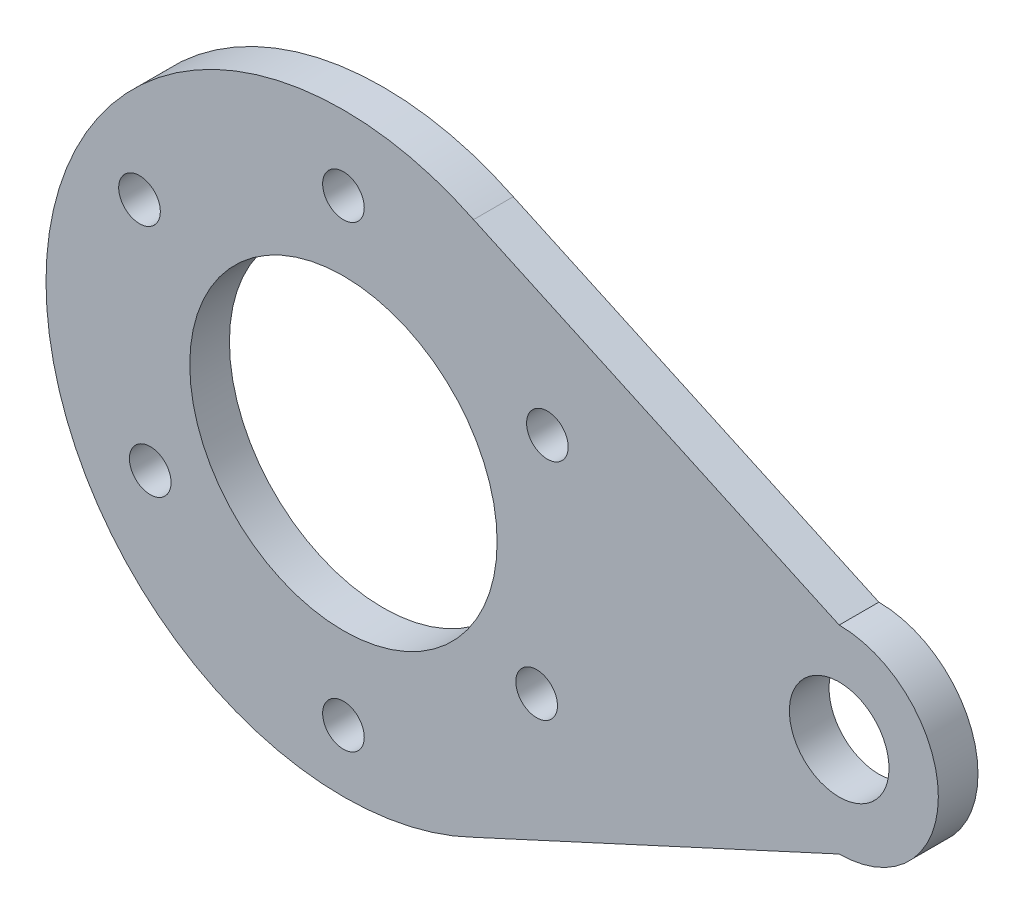
ISO-10303-21;
HEADER;
FILE_DESCRIPTION(('STEP AP214'),'2;1');
FILE_NAME('part.step','',(''),(''),'','','');
FILE_SCHEMA(('AUTOMOTIVE_DESIGN { 1 0 10303 214 1 1 1 1 }'));
ENDSEC;
DATA;
#1=APPLICATION_CONTEXT('core data for automotive mechanical design processes');
#2=APPLICATION_PROTOCOL_DEFINITION('international standard','automotive_design',2000,#1);
#3=PRODUCT_CONTEXT('',#1,'mechanical');
#4=PRODUCT('Part','Part','',(#3));
#5=PRODUCT_RELATED_PRODUCT_CATEGORY('part','',(#4));
#6=PRODUCT_DEFINITION_FORMATION('','',#4);
#7=PRODUCT_DEFINITION_CONTEXT('part definition',#1,'design');
#8=PRODUCT_DEFINITION('design','',#6,#7);
#9=PRODUCT_DEFINITION_SHAPE('','',#8);
#10=(LENGTH_UNIT() NAMED_UNIT(*) SI_UNIT(.MILLI.,.METRE.));
#11=(NAMED_UNIT(*) PLANE_ANGLE_UNIT() SI_UNIT($,.RADIAN.));
#12=(NAMED_UNIT(*) SI_UNIT($,.STERADIAN.) SOLID_ANGLE_UNIT());
#13=UNCERTAINTY_MEASURE_WITH_UNIT(LENGTH_MEASURE(1.E-05),#10,'distance_accuracy_value','');
#14=(GEOMETRIC_REPRESENTATION_CONTEXT(3) GLOBAL_UNCERTAINTY_ASSIGNED_CONTEXT((#13)) GLOBAL_UNIT_ASSIGNED_CONTEXT((#10,
#11,#12)) REPRESENTATION_CONTEXT('',''));
#15=CARTESIAN_POINT('',(0.,0.,0.));
#16=DIRECTION('',(0.,0.,1.));
#17=DIRECTION('',(1.,0.,0.));
#18=AXIS2_PLACEMENT_3D('',#15,#16,#17);
#19=CARTESIAN_POINT('',(52.5740743672686,-5.52758783429424,4.));
#20=DIRECTION('',(0.,0.,-1.));
#21=DIRECTION('',(-1.,0.,0.));
#22=AXIS2_PLACEMENT_3D('',#19,#20,#21);
#23=PLANE('',#22);
#24=CARTESIAN_POINT('',(52.5740743672686,-5.52758783429424,4.));
#25=DIRECTION('',(0.,0.,1.));
#26=DIRECTION('',(-1.,0.,0.));
#27=AXIS2_PLACEMENT_3D('',#24,#25,#26);
#28=CIRCLE('',#27,9.99999999999999);
#29=CARTESIAN_POINT('',(52.5740743672686,-15.5275878342942,4.));
#30=VERTEX_POINT('',#29);
#31=CARTESIAN_POINT('',(52.5740743672686,4.47241216570575,4.));
#32=VERTEX_POINT('',#31);
#33=EDGE_CURVE('E89',#30,#32,#28,.T.);
#34=ORIENTED_EDGE('',*,*,#33,.T.);
#35=DIRECTION('',(-0.90835898455297,0.418191290179384,0.));
#36=VECTOR('',#35,1.);
#37=CARTESIAN_POINT('',(52.5740743672686,4.47241216570575,4.));
#38=LINE('',#37,#36);
#39=CARTESIAN_POINT('',(15.6990743672686,21.4489644843398,4.));
#40=VERTEX_POINT('',#39);
#41=EDGE_CURVE('E84',#32,#40,#38,.T.);
#42=ORIENTED_EDGE('',*,*,#41,.T.);
#43=CARTESIAN_POINT('',(2.57407436726858,-5.52758783429424,4.));
#44=DIRECTION('',(0.,0.,1.));
#45=DIRECTION('',(1.,0.,0.));
#46=AXIS2_PLACEMENT_3D('',#43,#44,#45);
#47=CIRCLE('',#46,30.);
#48=CARTESIAN_POINT('',(15.6990743672686,-32.5041401529283,4.));
#49=VERTEX_POINT('',#48);
#50=EDGE_CURVE('E87',#40,#49,#47,.T.);
#51=ORIENTED_EDGE('',*,*,#50,.T.);
#52=DIRECTION('',(0.90835898455297,0.418191290179384,0.));
#53=VECTOR('',#52,1.);
#54=CARTESIAN_POINT('',(15.6990743672686,-32.5041401529283,4.));
#55=LINE('',#54,#53);
#56=EDGE_CURVE('E54',#49,#30,#55,.T.);
#57=ORIENTED_EDGE('',*,*,#56,.T.);
#58=EDGE_LOOP('',(#34,#42,#51,#57));
#59=FACE_BOUND('',#58,.T.);
#60=CARTESIAN_POINT('',(2.57407436726858,-29.2775878342943,4.));
#61=DIRECTION('',(0.,0.,1.));
#62=DIRECTION('',(1.,0.,0.));
#63=AXIS2_PLACEMENT_3D('',#60,#61,#62);
#64=CIRCLE('',#63,2.1);
#65=CARTESIAN_POINT('',(4.67407436726858,-29.2775878342943,4.));
#66=VERTEX_POINT('',#65);
#67=EDGE_CURVE('E104',#66,#66,#64,.T.);
#68=ORIENTED_EDGE('',*,*,#67,.F.);
#69=EDGE_LOOP('',(#68));
#70=FACE_BOUND('',#69,.T.);
#71=CARTESIAN_POINT('',(22.0596459524184,-16.7775878342942,4.));
#72=DIRECTION('',(0.,0.,1.));
#73=DIRECTION('',(1.,0.,0.));
#74=AXIS2_PLACEMENT_3D('',#71,#72,#73);
#75=CIRCLE('',#74,2.1);
#76=CARTESIAN_POINT('',(24.1596459524184,-16.7775878342942,4.));
#77=VERTEX_POINT('',#76);
#78=EDGE_CURVE('E119',#77,#77,#75,.T.);
#79=ORIENTED_EDGE('',*,*,#78,.F.);
#80=EDGE_LOOP('',(#79));
#81=FACE_BOUND('',#80,.T.);
#82=CARTESIAN_POINT('',(-17.9940289726118,6.34741216570586,4.));
#83=DIRECTION('',(0.,0.,1.));
#84=DIRECTION('',(1.,0.,0.));
#85=AXIS2_PLACEMENT_3D('',#82,#83,#84);
#86=CIRCLE('',#85,2.1);
#87=CARTESIAN_POINT('',(-15.8940289726118,6.34741216570586,4.));
#88=VERTEX_POINT('',#87);
#89=EDGE_CURVE('E125',#88,#88,#86,.T.);
#90=ORIENTED_EDGE('',*,*,#89,.F.);
#91=EDGE_LOOP('',(#90));
#92=FACE_BOUND('',#91,.T.);
#93=CARTESIAN_POINT('',(23.1421777071491,6.34741216570556,4.));
#94=DIRECTION('',(0.,0.,1.));
#95=DIRECTION('',(1.,0.,0.));
#96=AXIS2_PLACEMENT_3D('',#93,#94,#95);
#97=CIRCLE('',#96,2.1);
#98=CARTESIAN_POINT('',(25.2421777071491,6.34741216570556,4.));
#99=VERTEX_POINT('',#98);
#100=EDGE_CURVE('E131',#99,#99,#97,.T.);
#101=ORIENTED_EDGE('',*,*,#100,.F.);
#102=EDGE_LOOP('',(#101));
#103=FACE_BOUND('',#102,.T.);
#104=CARTESIAN_POINT('',(2.57407436726858,-5.52758783429424,4.));
#105=DIRECTION('',(0.,0.,1.));
#106=DIRECTION('',(1.,0.,0.));
#107=AXIS2_PLACEMENT_3D('',#104,#105,#106);
#108=CIRCLE('',#107,15.5);
#109=CARTESIAN_POINT('',(18.0740743672686,-5.52758783429424,4.));
#110=VERTEX_POINT('',#109);
#111=EDGE_CURVE('E137',#110,#110,#108,.T.);
#112=ORIENTED_EDGE('',*,*,#111,.F.);
#113=EDGE_LOOP('',(#112));
#114=FACE_BOUND('',#113,.T.);
#115=CARTESIAN_POINT('',(52.5740743672686,-5.52758783429424,4.));
#116=DIRECTION('',(0.,0.,1.));
#117=DIRECTION('',(1.,0.,0.));
#118=AXIS2_PLACEMENT_3D('',#115,#116,#117);
#119=CIRCLE('',#118,5.025);
#120=CARTESIAN_POINT('',(57.5990743672686,-5.52758783429424,4.));
#121=VERTEX_POINT('',#120);
#122=EDGE_CURVE('E143',#121,#121,#119,.T.);
#123=ORIENTED_EDGE('',*,*,#122,.F.);
#124=EDGE_LOOP('',(#123));
#125=FACE_BOUND('',#124,.T.);
#126=CARTESIAN_POINT('',(2.57407436726846,16.9724121657058,4.));
#127=DIRECTION('',(0.,0.,1.));
#128=DIRECTION('',(1.,0.,0.));
#129=AXIS2_PLACEMENT_3D('',#126,#127,#128);
#130=CIRCLE('',#129,2.1);
#131=CARTESIAN_POINT('',(4.67407436726846,16.9724121657058,4.));
#132=VERTEX_POINT('',#131);
#133=EDGE_CURVE('E149',#132,#132,#130,.T.);
#134=ORIENTED_EDGE('',*,*,#133,.F.);
#135=EDGE_LOOP('',(#134));
#136=FACE_BOUND('',#135,.T.);
#137=CARTESIAN_POINT('',(-16.9114972178812,-16.7775878342944,4.));
#138=DIRECTION('',(0.,0.,1.));
#139=DIRECTION('',(1.,0.,0.));
#140=AXIS2_PLACEMENT_3D('',#137,#138,#139);
#141=CIRCLE('',#140,2.1);
#142=CARTESIAN_POINT('',(-14.8114972178812,-16.7775878342944,4.));
#143=VERTEX_POINT('',#142);
#144=EDGE_CURVE('E155',#143,#143,#141,.T.);
#145=ORIENTED_EDGE('',*,*,#144,.F.);
#146=EDGE_LOOP('',(#145));
#147=FACE_BOUND('',#146,.T.);
#148=ADVANCED_FACE('F37',(#59,#70,#81,#92,#103,#114,#125,#136,#147),#23,.F.);
#149=CARTESIAN_POINT('',(52.5740743672686,-5.52758783429424,0.));
#150=DIRECTION('',(0.,0.,-1.));
#151=DIRECTION('',(-1.,0.,0.));
#152=AXIS2_PLACEMENT_3D('',#149,#150,#151);
#153=PLANE('',#152);
#154=CARTESIAN_POINT('',(2.57407436726846,16.9724121657058,0.));
#155=DIRECTION('',(0.,0.,1.));
#156=DIRECTION('',(1.,0.,0.));
#157=AXIS2_PLACEMENT_3D('',#154,#155,#156);
#158=CIRCLE('',#157,2.1);
#159=CARTESIAN_POINT('',(4.67407436726846,16.9724121657058,0.));
#160=VERTEX_POINT('',#159);
#161=EDGE_CURVE('E152',#160,#160,#158,.T.);
#162=ORIENTED_EDGE('',*,*,#161,.T.);
#163=EDGE_LOOP('',(#162));
#164=FACE_BOUND('',#163,.T.);
#165=CARTESIAN_POINT('',(2.57407436726858,-5.52758783429424,0.));
#166=DIRECTION('',(0.,0.,1.));
#167=DIRECTION('',(1.,0.,0.));
#168=AXIS2_PLACEMENT_3D('',#165,#166,#167);
#169=CIRCLE('',#168,15.5);
#170=CARTESIAN_POINT('',(18.0740743672686,-5.52758783429424,0.));
#171=VERTEX_POINT('',#170);
#172=EDGE_CURVE('E140',#171,#171,#169,.T.);
#173=ORIENTED_EDGE('',*,*,#172,.T.);
#174=EDGE_LOOP('',(#173));
#175=FACE_BOUND('',#174,.T.);
#176=CARTESIAN_POINT('',(-17.9940289726118,6.34741216570586,0.));
#177=DIRECTION('',(0.,0.,1.));
#178=DIRECTION('',(1.,0.,0.));
#179=AXIS2_PLACEMENT_3D('',#176,#177,#178);
#180=CIRCLE('',#179,2.1);
#181=CARTESIAN_POINT('',(-15.8940289726118,6.34741216570586,0.));
#182=VERTEX_POINT('',#181);
#183=EDGE_CURVE('E128',#182,#182,#180,.T.);
#184=ORIENTED_EDGE('',*,*,#183,.T.);
#185=EDGE_LOOP('',(#184));
#186=FACE_BOUND('',#185,.T.);
#187=CARTESIAN_POINT('',(2.57407436726858,-29.2775878342943,0.));
#188=DIRECTION('',(0.,0.,1.));
#189=DIRECTION('',(1.,0.,0.));
#190=AXIS2_PLACEMENT_3D('',#187,#188,#189);
#191=CIRCLE('',#190,2.1);
#192=CARTESIAN_POINT('',(4.67407436726858,-29.2775878342943,0.));
#193=VERTEX_POINT('',#192);
#194=EDGE_CURVE('E116',#193,#193,#191,.T.);
#195=ORIENTED_EDGE('',*,*,#194,.T.);
#196=EDGE_LOOP('',(#195));
#197=FACE_BOUND('',#196,.T.);
#198=CARTESIAN_POINT('',(52.5740743672686,-5.52758783429424,0.));
#199=DIRECTION('',(0.,0.,1.));
#200=DIRECTION('',(-1.,0.,0.));
#201=AXIS2_PLACEMENT_3D('',#198,#199,#200);
#202=CIRCLE('',#201,9.99999999999999);
#203=CARTESIAN_POINT('',(52.5740743672686,-15.5275878342942,0.));
#204=VERTEX_POINT('',#203);
#205=CARTESIAN_POINT('',(52.5740743672686,4.47241216570575,0.));
#206=VERTEX_POINT('',#205);
#207=EDGE_CURVE('E101',#204,#206,#202,.T.);
#208=ORIENTED_EDGE('',*,*,#207,.F.);
#209=DIRECTION('',(0.90835898455297,0.418191290179384,0.));
#210=VECTOR('',#209,1.);
#211=CARTESIAN_POINT('',(15.6990743672686,-32.5041401529283,0.));
#212=LINE('',#211,#210);
#213=CARTESIAN_POINT('',(15.6990743672686,-32.5041401529283,0.));
#214=VERTEX_POINT('',#213);
#215=EDGE_CURVE('E77',#214,#204,#212,.T.);
#216=ORIENTED_EDGE('',*,*,#215,.F.);
#217=CARTESIAN_POINT('',(2.57407436726858,-5.52758783429424,0.));
#218=DIRECTION('',(0.,0.,1.));
#219=DIRECTION('',(1.,0.,0.));
#220=AXIS2_PLACEMENT_3D('',#217,#218,#219);
#221=CIRCLE('',#220,30.);
#222=CARTESIAN_POINT('',(15.6990743672686,21.4489644843398,0.));
#223=VERTEX_POINT('',#222);
#224=EDGE_CURVE('E71',#223,#214,#221,.T.);
#225=ORIENTED_EDGE('',*,*,#224,.F.);
#226=DIRECTION('',(-0.90835898455297,0.418191290179384,0.));
#227=VECTOR('',#226,1.);
#228=CARTESIAN_POINT('',(52.5740743672686,4.47241216570575,0.));
#229=LINE('',#228,#227);
#230=EDGE_CURVE('E93',#206,#223,#229,.T.);
#231=ORIENTED_EDGE('',*,*,#230,.F.);
#232=EDGE_LOOP('',(#208,#216,#225,#231));
#233=FACE_BOUND('',#232,.T.);
#234=CARTESIAN_POINT('',(22.0596459524184,-16.7775878342942,0.));
#235=DIRECTION('',(0.,0.,1.));
#236=DIRECTION('',(1.,0.,0.));
#237=AXIS2_PLACEMENT_3D('',#234,#235,#236);
#238=CIRCLE('',#237,2.1);
#239=CARTESIAN_POINT('',(24.1596459524184,-16.7775878342942,0.));
#240=VERTEX_POINT('',#239);
#241=EDGE_CURVE('E122',#240,#240,#238,.T.);
#242=ORIENTED_EDGE('',*,*,#241,.T.);
#243=EDGE_LOOP('',(#242));
#244=FACE_BOUND('',#243,.T.);
#245=CARTESIAN_POINT('',(23.1421777071491,6.34741216570556,0.));
#246=DIRECTION('',(0.,0.,1.));
#247=DIRECTION('',(1.,0.,0.));
#248=AXIS2_PLACEMENT_3D('',#245,#246,#247);
#249=CIRCLE('',#248,2.1);
#250=CARTESIAN_POINT('',(25.2421777071491,6.34741216570556,0.));
#251=VERTEX_POINT('',#250);
#252=EDGE_CURVE('E134',#251,#251,#249,.T.);
#253=ORIENTED_EDGE('',*,*,#252,.T.);
#254=EDGE_LOOP('',(#253));
#255=FACE_BOUND('',#254,.T.);
#256=CARTESIAN_POINT('',(52.5740743672686,-5.52758783429424,0.));
#257=DIRECTION('',(0.,0.,1.));
#258=DIRECTION('',(1.,0.,0.));
#259=AXIS2_PLACEMENT_3D('',#256,#257,#258);
#260=CIRCLE('',#259,5.025);
#261=CARTESIAN_POINT('',(57.5990743672686,-5.52758783429424,0.));
#262=VERTEX_POINT('',#261);
#263=EDGE_CURVE('E146',#262,#262,#260,.T.);
#264=ORIENTED_EDGE('',*,*,#263,.T.);
#265=EDGE_LOOP('',(#264));
#266=FACE_BOUND('',#265,.T.);
#267=CARTESIAN_POINT('',(-16.9114972178812,-16.7775878342944,0.));
#268=DIRECTION('',(0.,0.,1.));
#269=DIRECTION('',(1.,0.,0.));
#270=AXIS2_PLACEMENT_3D('',#267,#268,#269);
#271=CIRCLE('',#270,2.1);
#272=CARTESIAN_POINT('',(-14.8114972178812,-16.7775878342944,0.));
#273=VERTEX_POINT('',#272);
#274=EDGE_CURVE('E158',#273,#273,#271,.T.);
#275=ORIENTED_EDGE('',*,*,#274,.T.);
#276=EDGE_LOOP('',(#275));
#277=FACE_BOUND('',#276,.T.);
#278=ADVANCED_FACE('F112',(#164,#175,#186,#197,#233,#244,#255,#266,#277),#153,.T.);
#279=CARTESIAN_POINT('',(52.5740743672686,-5.52758783429424,4.));
#280=DIRECTION('',(0.,0.,-1.));
#281=DIRECTION('',(-1.,0.,0.));
#282=AXIS2_PLACEMENT_3D('',#279,#280,#281);
#283=CYLINDRICAL_SURFACE('',#282,9.99999999999999);
#284=ORIENTED_EDGE('',*,*,#207,.T.);
#285=DIRECTION('',(0.,0.,-1.));
#286=VECTOR('',#285,1.);
#287=CARTESIAN_POINT('',(52.5740743672686,4.47241216570575,4.));
#288=LINE('',#287,#286);
#289=EDGE_CURVE('E11',#32,#206,#288,.T.);
#290=ORIENTED_EDGE('',*,*,#289,.F.);
#291=ORIENTED_EDGE('',*,*,#33,.F.);
#292=DIRECTION('',(0.,0.,-1.));
#293=VECTOR('',#292,1.);
#294=CARTESIAN_POINT('',(52.5740743672686,-15.5275878342942,4.));
#295=LINE('',#294,#293);
#296=EDGE_CURVE('E97',#30,#204,#295,.T.);
#297=ORIENTED_EDGE('',*,*,#296,.T.);
#298=EDGE_LOOP('',(#284,#290,#291,#297));
#299=FACE_BOUND('',#298,.T.);
#300=ADVANCED_FACE('F39',(#299),#283,.T.);
#301=CARTESIAN_POINT('',(52.5740743672686,4.47241216570575,4.));
#302=DIRECTION('',(-0.418191290179384,-0.90835898455297,0.));
#303=DIRECTION('',(0.90835898455297,-0.418191290179384,0.));
#304=AXIS2_PLACEMENT_3D('',#301,#302,#303);
#305=PLANE('',#304);
#306=ORIENTED_EDGE('',*,*,#230,.T.);
#307=DIRECTION('',(0.,0.,-1.));
#308=VECTOR('',#307,1.);
#309=CARTESIAN_POINT('',(15.6990743672686,21.4489644843398,4.));
#310=LINE('',#309,#308);
#311=EDGE_CURVE('E46',#40,#223,#310,.T.);
#312=ORIENTED_EDGE('',*,*,#311,.F.);
#313=ORIENTED_EDGE('',*,*,#41,.F.);
#314=ORIENTED_EDGE('',*,*,#289,.T.);
#315=EDGE_LOOP('',(#306,#312,#313,#314));
#316=FACE_BOUND('',#315,.T.);
#317=ADVANCED_FACE('F92',(#316),#305,.F.);
#318=CARTESIAN_POINT('',(2.57407436726858,-5.52758783429424,4.));
#319=DIRECTION('',(0.,0.,-1.));
#320=DIRECTION('',(-1.,0.,0.));
#321=AXIS2_PLACEMENT_3D('',#318,#319,#320);
#322=CYLINDRICAL_SURFACE('',#321,30.);
#323=ORIENTED_EDGE('',*,*,#224,.T.);
#324=DIRECTION('',(0.,0.,-1.));
#325=VECTOR('',#324,1.);
#326=CARTESIAN_POINT('',(15.6990743672686,-32.5041401529283,4.));
#327=LINE('',#326,#325);
#328=EDGE_CURVE('E94',#49,#214,#327,.T.);
#329=ORIENTED_EDGE('',*,*,#328,.F.);
#330=ORIENTED_EDGE('',*,*,#50,.F.);
#331=ORIENTED_EDGE('',*,*,#311,.T.);
#332=EDGE_LOOP('',(#323,#329,#330,#331));
#333=FACE_BOUND('',#332,.T.);
#334=ADVANCED_FACE('F95',(#333),#322,.T.);
#335=CARTESIAN_POINT('',(15.6990743672686,-32.5041401529283,4.));
#336=DIRECTION('',(-0.418191290179384,0.90835898455297,0.));
#337=DIRECTION('',(-0.90835898455297,-0.418191290179384,0.));
#338=AXIS2_PLACEMENT_3D('',#335,#336,#337);
#339=PLANE('',#338);
#340=ORIENTED_EDGE('',*,*,#215,.T.);
#341=ORIENTED_EDGE('',*,*,#296,.F.);
#342=ORIENTED_EDGE('',*,*,#56,.F.);
#343=ORIENTED_EDGE('',*,*,#328,.T.);
#344=EDGE_LOOP('',(#340,#341,#342,#343));
#345=FACE_BOUND('',#344,.T.);
#346=ADVANCED_FACE('F109',(#345),#339,.F.);
#347=CARTESIAN_POINT('',(2.57407436726858,-29.2775878342943,4.));
#348=DIRECTION('',(0.,0.,-1.));
#349=DIRECTION('',(-1.,0.,0.));
#350=AXIS2_PLACEMENT_3D('',#347,#348,#349);
#351=CYLINDRICAL_SURFACE('',#350,2.1);
#352=ORIENTED_EDGE('',*,*,#67,.T.);
#353=EDGE_LOOP('',(#352));
#354=FACE_BOUND('',#353,.T.);
#355=ORIENTED_EDGE('',*,*,#194,.F.);
#356=EDGE_LOOP('',(#355));
#357=FACE_BOUND('',#356,.T.);
#358=ADVANCED_FACE('F175',(#354,#357),#351,.F.);
#359=CARTESIAN_POINT('',(22.0596459524184,-16.7775878342942,4.));
#360=DIRECTION('',(0.,0.,-1.));
#361=DIRECTION('',(-1.,0.,0.));
#362=AXIS2_PLACEMENT_3D('',#359,#360,#361);
#363=CYLINDRICAL_SURFACE('',#362,2.1);
#364=ORIENTED_EDGE('',*,*,#78,.T.);
#365=EDGE_LOOP('',(#364));
#366=FACE_BOUND('',#365,.T.);
#367=ORIENTED_EDGE('',*,*,#241,.F.);
#368=EDGE_LOOP('',(#367));
#369=FACE_BOUND('',#368,.T.);
#370=ADVANCED_FACE('F221',(#366,#369),#363,.F.);
#371=CARTESIAN_POINT('',(-17.9940289726118,6.34741216570586,4.));
#372=DIRECTION('',(0.,0.,-1.));
#373=DIRECTION('',(-1.,0.,0.));
#374=AXIS2_PLACEMENT_3D('',#371,#372,#373);
#375=CYLINDRICAL_SURFACE('',#374,2.1);
#376=ORIENTED_EDGE('',*,*,#89,.T.);
#377=EDGE_LOOP('',(#376));
#378=FACE_BOUND('',#377,.T.);
#379=ORIENTED_EDGE('',*,*,#183,.F.);
#380=EDGE_LOOP('',(#379));
#381=FACE_BOUND('',#380,.T.);
#382=ADVANCED_FACE('F229',(#378,#381),#375,.F.);
#383=CARTESIAN_POINT('',(23.1421777071491,6.34741216570556,4.));
#384=DIRECTION('',(0.,0.,-1.));
#385=DIRECTION('',(-1.,0.,0.));
#386=AXIS2_PLACEMENT_3D('',#383,#384,#385);
#387=CYLINDRICAL_SURFACE('',#386,2.1);
#388=ORIENTED_EDGE('',*,*,#100,.T.);
#389=EDGE_LOOP('',(#388));
#390=FACE_BOUND('',#389,.T.);
#391=ORIENTED_EDGE('',*,*,#252,.F.);
#392=EDGE_LOOP('',(#391));
#393=FACE_BOUND('',#392,.T.);
#394=ADVANCED_FACE('F237',(#390,#393),#387,.F.);
#395=CARTESIAN_POINT('',(2.57407436726858,-5.52758783429424,4.));
#396=DIRECTION('',(0.,0.,-1.));
#397=DIRECTION('',(-1.,0.,0.));
#398=AXIS2_PLACEMENT_3D('',#395,#396,#397);
#399=CYLINDRICAL_SURFACE('',#398,15.5);
#400=ORIENTED_EDGE('',*,*,#111,.T.);
#401=EDGE_LOOP('',(#400));
#402=FACE_BOUND('',#401,.T.);
#403=ORIENTED_EDGE('',*,*,#172,.F.);
#404=EDGE_LOOP('',(#403));
#405=FACE_BOUND('',#404,.T.);
#406=ADVANCED_FACE('F246',(#402,#405),#399,.F.);
#407=CARTESIAN_POINT('',(52.5740743672686,-5.52758783429424,4.));
#408=DIRECTION('',(0.,0.,-1.));
#409=DIRECTION('',(-1.,0.,0.));
#410=AXIS2_PLACEMENT_3D('',#407,#408,#409);
#411=CYLINDRICAL_SURFACE('',#410,5.025);
#412=ORIENTED_EDGE('',*,*,#122,.T.);
#413=EDGE_LOOP('',(#412));
#414=FACE_BOUND('',#413,.T.);
#415=ORIENTED_EDGE('',*,*,#263,.F.);
#416=EDGE_LOOP('',(#415));
#417=FACE_BOUND('',#416,.T.);
#418=ADVANCED_FACE('F255',(#414,#417),#411,.F.);
#419=CARTESIAN_POINT('',(2.57407436726846,16.9724121657058,4.));
#420=DIRECTION('',(0.,0.,-1.));
#421=DIRECTION('',(-1.,0.,0.));
#422=AXIS2_PLACEMENT_3D('',#419,#420,#421);
#423=CYLINDRICAL_SURFACE('',#422,2.1);
#424=ORIENTED_EDGE('',*,*,#133,.T.);
#425=EDGE_LOOP('',(#424));
#426=FACE_BOUND('',#425,.T.);
#427=ORIENTED_EDGE('',*,*,#161,.F.);
#428=EDGE_LOOP('',(#427));
#429=FACE_BOUND('',#428,.T.);
#430=ADVANCED_FACE('F264',(#426,#429),#423,.F.);
#431=CARTESIAN_POINT('',(-16.9114972178812,-16.7775878342944,4.));
#432=DIRECTION('',(0.,0.,-1.));
#433=DIRECTION('',(-1.,0.,0.));
#434=AXIS2_PLACEMENT_3D('',#431,#432,#433);
#435=CYLINDRICAL_SURFACE('',#434,2.1);
#436=ORIENTED_EDGE('',*,*,#144,.T.);
#437=EDGE_LOOP('',(#436));
#438=FACE_BOUND('',#437,.T.);
#439=ORIENTED_EDGE('',*,*,#274,.F.);
#440=EDGE_LOOP('',(#439));
#441=FACE_BOUND('',#440,.T.);
#442=ADVANCED_FACE('F164',(#438,#441),#435,.F.);
#443=CLOSED_SHELL('',(#148,#278,#300,#317,#334,#346,#358,#370,#382,#394,#406,#418,#430,#442));
#444=MANIFOLD_SOLID_BREP('B2',#443);
#445=ADVANCED_BREP_SHAPE_REPRESENTATION('',(#18,#444),#14);
#446=SHAPE_DEFINITION_REPRESENTATION(#9,#445);
ENDSEC;
END-ISO-10303-21;
